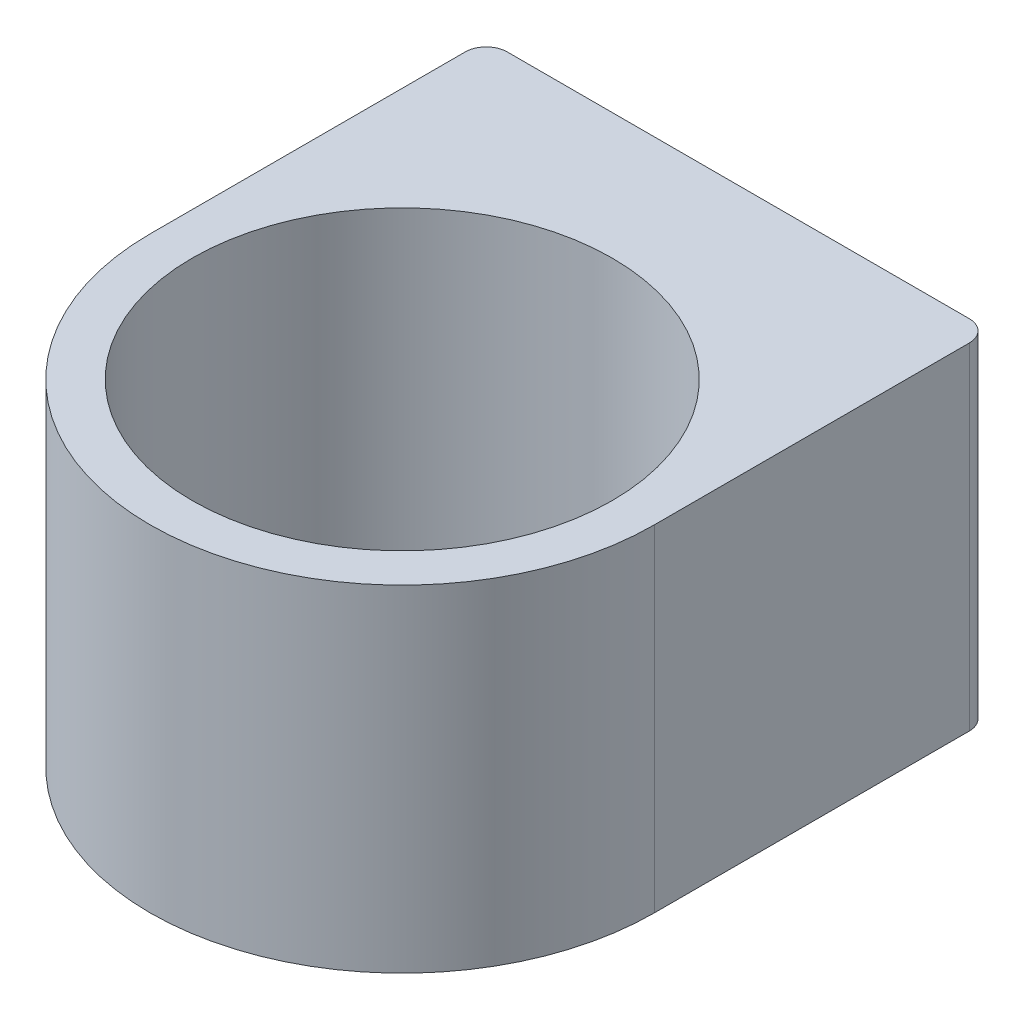
ISO-10303-21;
HEADER;
FILE_DESCRIPTION(('STEP AP214'),'2;1');
FILE_NAME('part.step','',(''),(''),'','','');
FILE_SCHEMA(('AUTOMOTIVE_DESIGN { 1 0 10303 214 1 1 1 1 }'));
ENDSEC;
DATA;
#1=APPLICATION_CONTEXT('core data for automotive mechanical design processes');
#2=APPLICATION_PROTOCOL_DEFINITION('international standard','automotive_design',2000,#1);
#3=PRODUCT_CONTEXT('',#1,'mechanical');
#4=PRODUCT('Part','Part','',(#3));
#5=PRODUCT_RELATED_PRODUCT_CATEGORY('part','',(#4));
#6=PRODUCT_DEFINITION_FORMATION('','',#4);
#7=PRODUCT_DEFINITION_CONTEXT('part definition',#1,'design');
#8=PRODUCT_DEFINITION('design','',#6,#7);
#9=PRODUCT_DEFINITION_SHAPE('','',#8);
#10=(LENGTH_UNIT() NAMED_UNIT(*) SI_UNIT(.MILLI.,.METRE.));
#11=(NAMED_UNIT(*) PLANE_ANGLE_UNIT() SI_UNIT($,.RADIAN.));
#12=(NAMED_UNIT(*) SI_UNIT($,.STERADIAN.) SOLID_ANGLE_UNIT());
#13=UNCERTAINTY_MEASURE_WITH_UNIT(LENGTH_MEASURE(1.E-05),#10,'distance_accuracy_value','');
#14=(GEOMETRIC_REPRESENTATION_CONTEXT(3) GLOBAL_UNCERTAINTY_ASSIGNED_CONTEXT((#13)) GLOBAL_UNIT_ASSIGNED_CONTEXT((#10,
#11,#12)) REPRESENTATION_CONTEXT('',''));
#15=CARTESIAN_POINT('',(0.,0.,0.));
#16=DIRECTION('',(0.,0.,1.));
#17=DIRECTION('',(1.,0.,0.));
#18=AXIS2_PLACEMENT_3D('',#15,#16,#17);
#19=CARTESIAN_POINT('',(0.,40.,0.));
#20=DIRECTION('',(0.,1.,0.));
#21=DIRECTION('',(0.,0.,1.));
#22=AXIS2_PLACEMENT_3D('',#19,#20,#21);
#23=PLANE('',#22);
#24=DIRECTION('',(-1.,0.,0.));
#25=VECTOR('',#24,1.);
#26=CARTESIAN_POINT('',(-60.,40.,-80.));
#27=LINE('',#26,#25);
#28=CARTESIAN_POINT('',(55.,40.,-80.));
#29=VERTEX_POINT('',#28);
#30=CARTESIAN_POINT('',(-55.,40.,-80.));
#31=VERTEX_POINT('',#30);
#32=EDGE_CURVE('E104',#29,#31,#27,.T.);
#33=ORIENTED_EDGE('',*,*,#32,.T.);
#34=CARTESIAN_POINT('',(-55.,40.,-75.));
#35=DIRECTION('',(0.,1.,0.));
#36=DIRECTION('',(0.,0.,1.));
#37=AXIS2_PLACEMENT_3D('',#34,#35,#36);
#38=CIRCLE('',#37,5.);
#39=CARTESIAN_POINT('',(-60.,40.,-75.));
#40=VERTEX_POINT('',#39);
#41=EDGE_CURVE('E137',#31,#40,#38,.T.);
#42=ORIENTED_EDGE('',*,*,#41,.T.);
#43=DIRECTION('',(0.,0.,1.));
#44=VECTOR('',#43,1.);
#45=CARTESIAN_POINT('',(-60.,40.,0.));
#46=LINE('',#45,#44);
#47=CARTESIAN_POINT('',(-60.,40.,0.));
#48=VERTEX_POINT('',#47);
#49=EDGE_CURVE('E110',#40,#48,#46,.T.);
#50=ORIENTED_EDGE('',*,*,#49,.T.);
#51=CARTESIAN_POINT('',(0.,40.,0.));
#52=DIRECTION('',(0.,1.,0.));
#53=DIRECTION('',(0.,0.,1.));
#54=AXIS2_PLACEMENT_3D('',#51,#52,#53);
#55=CIRCLE('',#54,60.);
#56=CARTESIAN_POINT('',(60.,40.,0.));
#57=VERTEX_POINT('',#56);
#58=EDGE_CURVE('E105',#48,#57,#55,.T.);
#59=ORIENTED_EDGE('',*,*,#58,.T.);
#60=DIRECTION('',(0.,0.,-1.));
#61=VECTOR('',#60,1.);
#62=CARTESIAN_POINT('',(60.,40.,-80.));
#63=LINE('',#62,#61);
#64=CARTESIAN_POINT('',(60.,40.,-75.));
#65=VERTEX_POINT('',#64);
#66=EDGE_CURVE('E96',#57,#65,#63,.T.);
#67=ORIENTED_EDGE('',*,*,#66,.T.);
#68=CARTESIAN_POINT('',(55.,40.,-75.));
#69=DIRECTION('',(0.,1.,0.));
#70=DIRECTION('',(0.,0.,1.));
#71=AXIS2_PLACEMENT_3D('',#68,#69,#70);
#72=CIRCLE('',#71,5.);
#73=EDGE_CURVE('E135',#65,#29,#72,.T.);
#74=ORIENTED_EDGE('',*,*,#73,.T.);
#75=EDGE_LOOP('',(#33,#42,#50,#59,#67,#74));
#76=FACE_BOUND('',#75,.T.);
#77=CARTESIAN_POINT('',(0.,40.,0.));
#78=DIRECTION('',(0.,1.,0.));
#79=DIRECTION('',(0.,0.,1.));
#80=AXIS2_PLACEMENT_3D('',#77,#78,#79);
#81=CIRCLE('',#80,50.);
#82=CARTESIAN_POINT('',(0.,40.,50.));
#83=VERTEX_POINT('',#82);
#84=EDGE_CURVE('E157',#83,#83,#81,.T.);
#85=ORIENTED_EDGE('',*,*,#84,.F.);
#86=EDGE_LOOP('',(#85));
#87=FACE_BOUND('',#86,.T.);
#88=ADVANCED_FACE('F43',(#76,#87),#23,.T.);
#89=CARTESIAN_POINT('',(0.,-40.,0.));
#90=DIRECTION('',(0.,1.,0.));
#91=DIRECTION('',(0.,0.,1.));
#92=AXIS2_PLACEMENT_3D('',#89,#90,#91);
#93=PLANE('',#92);
#94=DIRECTION('',(0.,0.,1.));
#95=VECTOR('',#94,1.);
#96=CARTESIAN_POINT('',(-60.,-40.,0.));
#97=LINE('',#96,#95);
#98=CARTESIAN_POINT('',(-60.,-40.,-75.));
#99=VERTEX_POINT('',#98);
#100=CARTESIAN_POINT('',(-60.,-40.,0.));
#101=VERTEX_POINT('',#100);
#102=EDGE_CURVE('E114',#99,#101,#97,.T.);
#103=ORIENTED_EDGE('',*,*,#102,.F.);
#104=CARTESIAN_POINT('',(-55.,-40.,-75.));
#105=DIRECTION('',(0.,1.,0.));
#106=DIRECTION('',(0.,0.,1.));
#107=AXIS2_PLACEMENT_3D('',#104,#105,#106);
#108=CIRCLE('',#107,5.);
#109=CARTESIAN_POINT('',(-55.,-40.,-80.));
#110=VERTEX_POINT('',#109);
#111=EDGE_CURVE('E129',#99,#110,#108,.F.);
#112=ORIENTED_EDGE('',*,*,#111,.T.);
#113=DIRECTION('',(-1.,0.,0.));
#114=VECTOR('',#113,1.);
#115=CARTESIAN_POINT('',(-60.,-40.,-80.));
#116=LINE('',#115,#114);
#117=CARTESIAN_POINT('',(55.,-40.,-80.));
#118=VERTEX_POINT('',#117);
#119=EDGE_CURVE('E150',#118,#110,#116,.T.);
#120=ORIENTED_EDGE('',*,*,#119,.F.);
#121=CARTESIAN_POINT('',(55.,-40.,-75.));
#122=DIRECTION('',(0.,1.,0.));
#123=DIRECTION('',(0.,0.,1.));
#124=AXIS2_PLACEMENT_3D('',#121,#122,#123);
#125=CIRCLE('',#124,5.);
#126=CARTESIAN_POINT('',(60.,-40.,-75.));
#127=VERTEX_POINT('',#126);
#128=EDGE_CURVE('E123',#118,#127,#125,.F.);
#129=ORIENTED_EDGE('',*,*,#128,.T.);
#130=DIRECTION('',(0.,0.,-1.));
#131=VECTOR('',#130,1.);
#132=CARTESIAN_POINT('',(60.,-40.,-80.));
#133=LINE('',#132,#131);
#134=CARTESIAN_POINT('',(60.,-40.,0.));
#135=VERTEX_POINT('',#134);
#136=EDGE_CURVE('E153',#135,#127,#133,.T.);
#137=ORIENTED_EDGE('',*,*,#136,.F.);
#138=CARTESIAN_POINT('',(0.,-40.,0.));
#139=DIRECTION('',(0.,1.,0.));
#140=DIRECTION('',(0.,0.,1.));
#141=AXIS2_PLACEMENT_3D('',#138,#139,#140);
#142=CIRCLE('',#141,60.);
#143=EDGE_CURVE('E118',#101,#135,#142,.T.);
#144=ORIENTED_EDGE('',*,*,#143,.F.);
#145=EDGE_LOOP('',(#103,#112,#120,#129,#137,#144));
#146=FACE_BOUND('',#145,.T.);
#147=CARTESIAN_POINT('',(0.,-40.,0.));
#148=DIRECTION('',(0.,1.,0.));
#149=DIRECTION('',(0.,0.,1.));
#150=AXIS2_PLACEMENT_3D('',#147,#148,#149);
#151=CIRCLE('',#150,50.);
#152=CARTESIAN_POINT('',(0.,-40.,50.));
#153=VERTEX_POINT('',#152);
#154=EDGE_CURVE('E160',#153,#153,#151,.T.);
#155=ORIENTED_EDGE('',*,*,#154,.T.);
#156=EDGE_LOOP('',(#155));
#157=FACE_BOUND('',#156,.T.);
#158=ADVANCED_FACE('F148',(#146,#157),#93,.F.);
#159=CARTESIAN_POINT('',(0.,40.,0.));
#160=DIRECTION('',(0.,-1.,0.));
#161=DIRECTION('',(0.,0.,-1.));
#162=AXIS2_PLACEMENT_3D('',#159,#160,#161);
#163=CYLINDRICAL_SURFACE('',#162,60.);
#164=ORIENTED_EDGE('',*,*,#143,.T.);
#165=DIRECTION('',(0.,-1.,0.));
#166=VECTOR('',#165,1.);
#167=CARTESIAN_POINT('',(60.,40.,0.));
#168=LINE('',#167,#166);
#169=EDGE_CURVE('E100',#57,#135,#168,.T.);
#170=ORIENTED_EDGE('',*,*,#169,.F.);
#171=ORIENTED_EDGE('',*,*,#58,.F.);
#172=DIRECTION('',(0.,-1.,0.));
#173=VECTOR('',#172,1.);
#174=CARTESIAN_POINT('',(-60.,40.,0.));
#175=LINE('',#174,#173);
#176=EDGE_CURVE('E120',#48,#101,#175,.T.);
#177=ORIENTED_EDGE('',*,*,#176,.T.);
#178=EDGE_LOOP('',(#164,#170,#171,#177));
#179=FACE_BOUND('',#178,.T.);
#180=ADVANCED_FACE('F116',(#179),#163,.T.);
#181=CARTESIAN_POINT('',(60.,40.,-80.));
#182=DIRECTION('',(-1.,0.,0.));
#183=DIRECTION('',(0.,0.,1.));
#184=AXIS2_PLACEMENT_3D('',#181,#182,#183);
#185=PLANE('',#184);
#186=ORIENTED_EDGE('',*,*,#136,.T.);
#187=DIRECTION('',(0.,-1.,0.));
#188=VECTOR('',#187,1.);
#189=CARTESIAN_POINT('',(60.,40.,-75.));
#190=LINE('',#189,#188);
#191=EDGE_CURVE('E51',#127,#65,#190,.F.);
#192=ORIENTED_EDGE('',*,*,#191,.T.);
#193=ORIENTED_EDGE('',*,*,#66,.F.);
#194=ORIENTED_EDGE('',*,*,#169,.T.);
#195=EDGE_LOOP('',(#186,#192,#193,#194));
#196=FACE_BOUND('',#195,.T.);
#197=ADVANCED_FACE('F98',(#196),#185,.F.);
#198=CARTESIAN_POINT('',(-60.,40.,-80.));
#199=DIRECTION('',(0.,0.,1.));
#200=DIRECTION('',(1.,0.,0.));
#201=AXIS2_PLACEMENT_3D('',#198,#199,#200);
#202=PLANE('',#201);
#203=CARTESIAN_POINT('',(0.,0.,-80.));
#204=DIRECTION('',(0.,0.,1.));
#205=DIRECTION('',(1.,0.,0.));
#206=AXIS2_PLACEMENT_3D('',#203,#204,#205);
#207=CIRCLE('',#206,20.);
#208=CARTESIAN_POINT('',(20.,0.,-80.));
#209=VERTEX_POINT('',#208);
#210=EDGE_CURVE('E11',#209,#209,#207,.F.);
#211=ORIENTED_EDGE('',*,*,#210,.F.);
#212=EDGE_LOOP('',(#211));
#213=FACE_BOUND('',#212,.T.);
#214=ORIENTED_EDGE('',*,*,#119,.T.);
#215=DIRECTION('',(0.,-1.,0.));
#216=VECTOR('',#215,1.);
#217=CARTESIAN_POINT('',(-55.,40.,-80.));
#218=LINE('',#217,#216);
#219=EDGE_CURVE('E65',#110,#31,#218,.F.);
#220=ORIENTED_EDGE('',*,*,#219,.T.);
#221=ORIENTED_EDGE('',*,*,#32,.F.);
#222=DIRECTION('',(0.,-1.,0.));
#223=VECTOR('',#222,1.);
#224=CARTESIAN_POINT('',(55.,40.,-80.));
#225=LINE('',#224,#223);
#226=EDGE_CURVE('E131',#29,#118,#225,.T.);
#227=ORIENTED_EDGE('',*,*,#226,.T.);
#228=EDGE_LOOP('',(#214,#220,#221,#227));
#229=FACE_BOUND('',#228,.T.);
#230=ADVANCED_FACE('F151',(#213,#229),#202,.F.);
#231=CARTESIAN_POINT('',(-60.,40.,0.));
#232=DIRECTION('',(1.,0.,0.));
#233=DIRECTION('',(0.,0.,-1.));
#234=AXIS2_PLACEMENT_3D('',#231,#232,#233);
#235=PLANE('',#234);
#236=ORIENTED_EDGE('',*,*,#49,.F.);
#237=DIRECTION('',(0.,-1.,0.));
#238=VECTOR('',#237,1.);
#239=CARTESIAN_POINT('',(-60.,40.,-75.));
#240=LINE('',#239,#238);
#241=EDGE_CURVE('E119',#40,#99,#240,.T.);
#242=ORIENTED_EDGE('',*,*,#241,.T.);
#243=ORIENTED_EDGE('',*,*,#102,.T.);
#244=ORIENTED_EDGE('',*,*,#176,.F.);
#245=EDGE_LOOP('',(#236,#242,#243,#244));
#246=FACE_BOUND('',#245,.T.);
#247=ADVANCED_FACE('F142',(#246),#235,.F.);
#248=CARTESIAN_POINT('',(0.,40.,0.));
#249=DIRECTION('',(0.,-1.,0.));
#250=DIRECTION('',(0.,0.,-1.));
#251=AXIS2_PLACEMENT_3D('',#248,#249,#250);
#252=CYLINDRICAL_SURFACE('',#251,50.);
#253=ORIENTED_EDGE('',*,*,#84,.T.);
#254=EDGE_LOOP('',(#253));
#255=FACE_BOUND('',#254,.T.);
#256=ORIENTED_EDGE('',*,*,#154,.F.);
#257=EDGE_LOOP('',(#256));
#258=FACE_BOUND('',#257,.T.);
#259=ADVANCED_FACE('F197',(#255,#258),#252,.F.);
#260=CARTESIAN_POINT('',(-55.,40.,-75.));
#261=DIRECTION('',(0.,-1.,0.));
#262=DIRECTION('',(0.,0.,-1.));
#263=AXIS2_PLACEMENT_3D('',#260,#261,#262);
#264=CYLINDRICAL_SURFACE('',#263,5.);
#265=ORIENTED_EDGE('',*,*,#41,.F.);
#266=ORIENTED_EDGE('',*,*,#219,.F.);
#267=ORIENTED_EDGE('',*,*,#111,.F.);
#268=ORIENTED_EDGE('',*,*,#241,.F.);
#269=EDGE_LOOP('',(#265,#266,#267,#268));
#270=FACE_BOUND('',#269,.T.);
#271=ADVANCED_FACE('F145',(#270),#264,.T.);
#272=CARTESIAN_POINT('',(55.,40.,-75.));
#273=DIRECTION('',(0.,-1.,0.));
#274=DIRECTION('',(0.,0.,-1.));
#275=AXIS2_PLACEMENT_3D('',#272,#273,#274);
#276=CYLINDRICAL_SURFACE('',#275,5.);
#277=ORIENTED_EDGE('',*,*,#73,.F.);
#278=ORIENTED_EDGE('',*,*,#191,.F.);
#279=ORIENTED_EDGE('',*,*,#128,.F.);
#280=ORIENTED_EDGE('',*,*,#226,.F.);
#281=EDGE_LOOP('',(#277,#278,#279,#280));
#282=FACE_BOUND('',#281,.T.);
#283=ADVANCED_FACE('F45',(#282),#276,.T.);
#284=CARTESIAN_POINT('',(0.,0.,-100.));
#285=DIRECTION('',(0.,0.,1.));
#286=DIRECTION('',(1.,0.,0.));
#287=AXIS2_PLACEMENT_3D('',#284,#285,#286);
#288=CYLINDRICAL_SURFACE('',#287,20.);
#289=CARTESIAN_POINT('',(0.,0.,-100.));
#290=DIRECTION('',(0.,0.,-1.));
#291=DIRECTION('',(-1.,0.,0.));
#292=AXIS2_PLACEMENT_3D('',#289,#290,#291);
#293=CIRCLE('',#292,20.);
#294=CARTESIAN_POINT('',(-20.,0.,-100.));
#295=VERTEX_POINT('',#294);
#296=EDGE_CURVE('E163',#295,#295,#293,.T.);
#297=ORIENTED_EDGE('',*,*,#296,.F.);
#298=EDGE_LOOP('',(#297));
#299=FACE_BOUND('',#298,.T.);
#300=ORIENTED_EDGE('',*,*,#210,.T.);
#301=EDGE_LOOP('',(#300));
#302=FACE_BOUND('',#301,.T.);
#303=ADVANCED_FACE('F182',(#299,#302),#288,.T.);
#304=CARTESIAN_POINT('',(0.,0.,-100.));
#305=DIRECTION('',(0.,0.,-1.));
#306=DIRECTION('',(-1.,0.,0.));
#307=AXIS2_PLACEMENT_3D('',#304,#305,#306);
#308=PLANE('',#307);
#309=CARTESIAN_POINT('',(0.,0.,-100.));
#310=DIRECTION('',(0.,0.,-1.));
#311=DIRECTION('',(-1.,0.,0.));
#312=AXIS2_PLACEMENT_3D('',#309,#310,#311);
#313=CIRCLE('',#312,16.5);
#314=CARTESIAN_POINT('',(-16.5,0.,-100.));
#315=VERTEX_POINT('',#314);
#316=EDGE_CURVE('E171',#315,#315,#313,.T.);
#317=ORIENTED_EDGE('',*,*,#316,.F.);
#318=EDGE_LOOP('',(#317));
#319=FACE_BOUND('',#318,.T.);
#320=ORIENTED_EDGE('',*,*,#296,.T.);
#321=EDGE_LOOP('',(#320));
#322=FACE_BOUND('',#321,.T.);
#323=ADVANCED_FACE('F178',(#319,#322),#308,.T.);
#324=CARTESIAN_POINT('',(-60.,40.,-80.));
#325=DIRECTION('',(0.,0.,1.));
#326=DIRECTION('',(1.,0.,0.));
#327=AXIS2_PLACEMENT_3D('',#324,#325,#326);
#328=PLANE('',#327);
#329=CARTESIAN_POINT('',(0.,0.,-80.));
#330=DIRECTION('',(0.,0.,1.));
#331=DIRECTION('',(1.,0.,0.));
#332=AXIS2_PLACEMENT_3D('',#329,#330,#331);
#333=CIRCLE('',#332,16.5);
#334=CARTESIAN_POINT('',(16.5,0.,-80.));
#335=VERTEX_POINT('',#334);
#336=EDGE_CURVE('E168',#335,#335,#333,.F.);
#337=ORIENTED_EDGE('',*,*,#336,.T.);
#338=EDGE_LOOP('',(#337));
#339=FACE_BOUND('',#338,.T.);
#340=ADVANCED_FACE('F181',(#339),#328,.F.);
#341=CARTESIAN_POINT('',(0.,0.,-33.3309524416879));
#342=DIRECTION('',(0.,0.,-1.));
#343=DIRECTION('',(-1.,0.,0.));
#344=AXIS2_PLACEMENT_3D('',#341,#342,#343);
#345=CYLINDRICAL_SURFACE('',#344,16.5);
#346=ORIENTED_EDGE('',*,*,#316,.T.);
#347=EDGE_LOOP('',(#346));
#348=FACE_BOUND('',#347,.T.);
#349=ORIENTED_EDGE('',*,*,#336,.F.);
#350=EDGE_LOOP('',(#349));
#351=FACE_BOUND('',#350,.T.);
#352=ADVANCED_FACE('F175',(#348,#351),#345,.F.);
#353=CLOSED_SHELL('',(#88,#158,#180,#197,#230,#247,#259,#271,#283,#303,#323,#340,#352));
#354=MANIFOLD_SOLID_BREP('B2',#353);
#355=ADVANCED_BREP_SHAPE_REPRESENTATION('',(#18,#354),#14);
#356=SHAPE_DEFINITION_REPRESENTATION(#9,#355);
ENDSEC;
END-ISO-10303-21;
